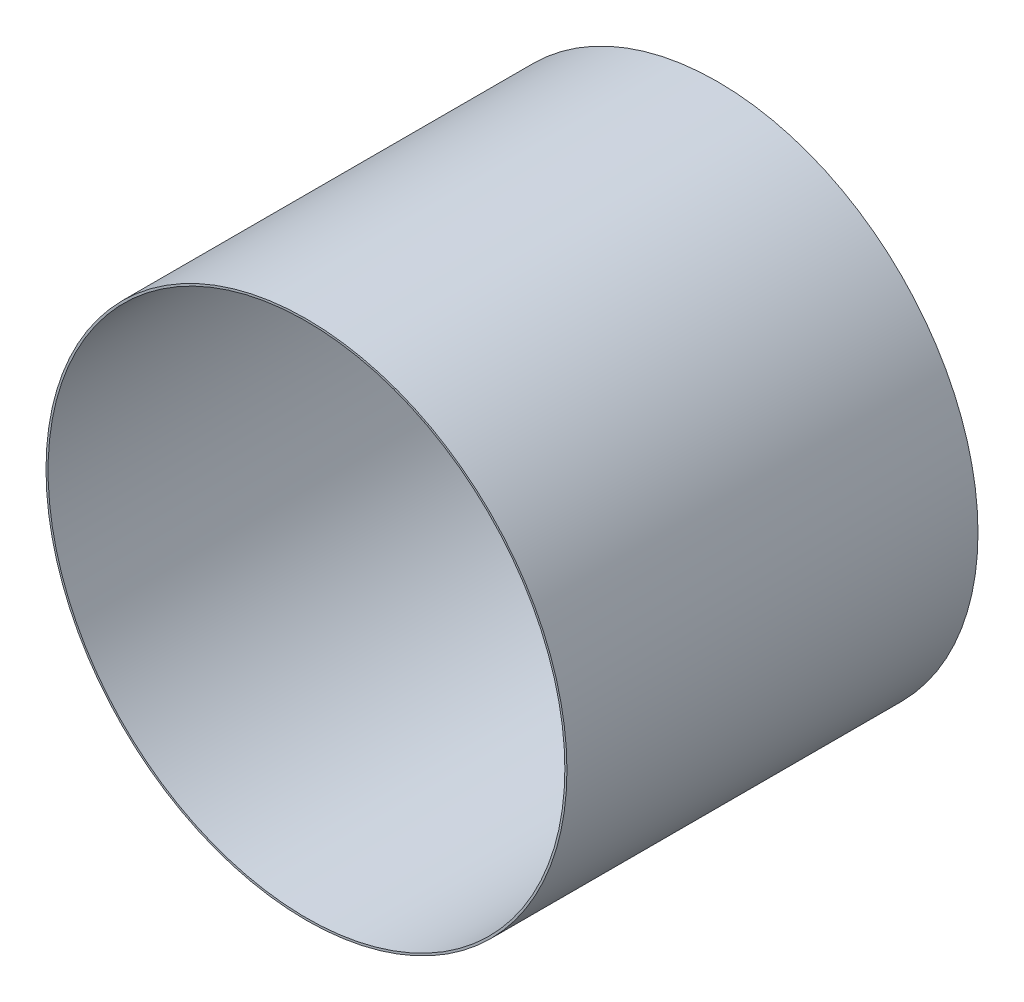
ISO-10303-21;
HEADER;
FILE_DESCRIPTION(('STEP AP214'),'2;1');
FILE_NAME('part.step','',(''),(''),'','','');
FILE_SCHEMA(('AUTOMOTIVE_DESIGN { 1 0 10303 214 1 1 1 1 }'));
ENDSEC;
DATA;
#1=APPLICATION_CONTEXT('core data for automotive mechanical design processes');
#2=APPLICATION_PROTOCOL_DEFINITION('international standard','automotive_design',2000,#1);
#3=PRODUCT_CONTEXT('',#1,'mechanical');
#4=PRODUCT('Part','Part','',(#3));
#5=PRODUCT_RELATED_PRODUCT_CATEGORY('part','',(#4));
#6=PRODUCT_DEFINITION_FORMATION('','',#4);
#7=PRODUCT_DEFINITION_CONTEXT('part definition',#1,'design');
#8=PRODUCT_DEFINITION('design','',#6,#7);
#9=PRODUCT_DEFINITION_SHAPE('','',#8);
#10=(LENGTH_UNIT() NAMED_UNIT(*) SI_UNIT(.MILLI.,.METRE.));
#11=(NAMED_UNIT(*) PLANE_ANGLE_UNIT() SI_UNIT($,.RADIAN.));
#12=(NAMED_UNIT(*) SI_UNIT($,.STERADIAN.) SOLID_ANGLE_UNIT());
#13=UNCERTAINTY_MEASURE_WITH_UNIT(LENGTH_MEASURE(1.E-05),#10,'distance_accuracy_value','');
#14=(GEOMETRIC_REPRESENTATION_CONTEXT(3) GLOBAL_UNCERTAINTY_ASSIGNED_CONTEXT((#13)) GLOBAL_UNIT_ASSIGNED_CONTEXT((#10,
#11,#12)) REPRESENTATION_CONTEXT('',''));
#15=CARTESIAN_POINT('',(0.,0.,0.));
#16=DIRECTION('',(0.,0.,1.));
#17=DIRECTION('',(1.,0.,0.));
#18=AXIS2_PLACEMENT_3D('',#15,#16,#17);
#19=CARTESIAN_POINT('',(-33.4047999999946,-33.4047906716414,-19.6999999999999));
#20=DIRECTION('',(0.,0.,1.));
#21=DIRECTION('',(1.,0.,0.));
#22=AXIS2_PLACEMENT_3D('',#19,#20,#21);
#23=PLANE('',#22);
#24=CARTESIAN_POINT('',(0.,0.,-19.6999999999999));
#25=DIRECTION('',(0.,0.,1.));
#26=DIRECTION('',(1.,0.,0.));
#27=AXIS2_PLACEMENT_3D('',#24,#25,#26);
#28=CIRCLE('',#27,31.864999999997);
#29=CARTESIAN_POINT('',(31.864999999997,0.,-19.6999999999999));
#30=VERTEX_POINT('',#29);
#31=EDGE_CURVE('E28',#30,#30,#28,.T.);
#32=ORIENTED_EDGE('',*,*,#31,.T.);
#33=EDGE_LOOP('',(#32));
#34=FACE_BOUND('',#33,.T.);
#35=CARTESIAN_POINT('',(0.,0.,-19.6999999999999));
#36=DIRECTION('',(0.,0.,1.));
#37=DIRECTION('',(1.,0.,0.));
#38=AXIS2_PLACEMENT_3D('',#35,#36,#37);
#39=CIRCLE('',#38,32.1200000000036);
#40=CARTESIAN_POINT('',(32.1200000000036,0.,-19.6999999999999));
#41=VERTEX_POINT('',#40);
#42=EDGE_CURVE('E19',#41,#41,#39,.F.);
#43=ORIENTED_EDGE('',*,*,#42,.T.);
#44=EDGE_LOOP('',(#43));
#45=FACE_BOUND('',#44,.T.);
#46=ADVANCED_FACE('F15',(#34,#45),#23,.F.);
#47=CARTESIAN_POINT('',(0.,0.,-19.6999999999999));
#48=DIRECTION('',(0.,0.,1.));
#49=DIRECTION('',(1.,0.,0.));
#50=AXIS2_PLACEMENT_3D('',#47,#48,#49);
#51=CYLINDRICAL_SURFACE('',#50,32.1200000000036);
#52=ORIENTED_EDGE('',*,*,#42,.F.);
#53=EDGE_LOOP('',(#52));
#54=FACE_BOUND('',#53,.T.);
#55=CARTESIAN_POINT('',(0.,0.,30.9899999999878));
#56=DIRECTION('',(0.,0.,1.));
#57=DIRECTION('',(1.,0.,0.));
#58=AXIS2_PLACEMENT_3D('',#55,#56,#57);
#59=CIRCLE('',#58,32.1200000000036);
#60=CARTESIAN_POINT('',(32.1200000000036,0.,30.9899999999878));
#61=VERTEX_POINT('',#60);
#62=EDGE_CURVE('E23',#61,#61,#59,.F.);
#63=ORIENTED_EDGE('',*,*,#62,.T.);
#64=EDGE_LOOP('',(#63));
#65=FACE_BOUND('',#64,.T.);
#66=ADVANCED_FACE('F37',(#54,#65),#51,.T.);
#67=CARTESIAN_POINT('',(0.,0.,-19.6999999999999));
#68=DIRECTION('',(0.,0.,1.));
#69=DIRECTION('',(1.,0.,0.));
#70=AXIS2_PLACEMENT_3D('',#67,#68,#69);
#71=CYLINDRICAL_SURFACE('',#70,31.864999999997);
#72=ORIENTED_EDGE('',*,*,#31,.F.);
#73=EDGE_LOOP('',(#72));
#74=FACE_BOUND('',#73,.T.);
#75=CARTESIAN_POINT('',(0.,0.,30.9899999999878));
#76=DIRECTION('',(0.,0.,1.));
#77=DIRECTION('',(1.,0.,0.));
#78=AXIS2_PLACEMENT_3D('',#75,#76,#77);
#79=CIRCLE('',#78,31.864999999997);
#80=CARTESIAN_POINT('',(31.864999999997,0.,30.9899999999878));
#81=VERTEX_POINT('',#80);
#82=EDGE_CURVE('E10',#81,#81,#79,.T.);
#83=ORIENTED_EDGE('',*,*,#82,.T.);
#84=EDGE_LOOP('',(#83));
#85=FACE_BOUND('',#84,.T.);
#86=ADVANCED_FACE('F40',(#74,#85),#71,.F.);
#87=CARTESIAN_POINT('',(-33.4047999999946,-33.4047906716414,30.9899999999878));
#88=DIRECTION('',(0.,0.,1.));
#89=DIRECTION('',(1.,0.,0.));
#90=AXIS2_PLACEMENT_3D('',#87,#88,#89);
#91=PLANE('',#90);
#92=ORIENTED_EDGE('',*,*,#82,.F.);
#93=EDGE_LOOP('',(#92));
#94=FACE_BOUND('',#93,.T.);
#95=ORIENTED_EDGE('',*,*,#62,.F.);
#96=EDGE_LOOP('',(#95));
#97=FACE_BOUND('',#96,.T.);
#98=ADVANCED_FACE('F17',(#94,#97),#91,.T.);
#99=CLOSED_SHELL('',(#46,#66,#86,#98));
#100=MANIFOLD_SOLID_BREP('B1',#99);
#101=ADVANCED_BREP_SHAPE_REPRESENTATION('',(#18,#100),#14);
#102=SHAPE_DEFINITION_REPRESENTATION(#9,#101);
ENDSEC;
END-ISO-10303-21;
